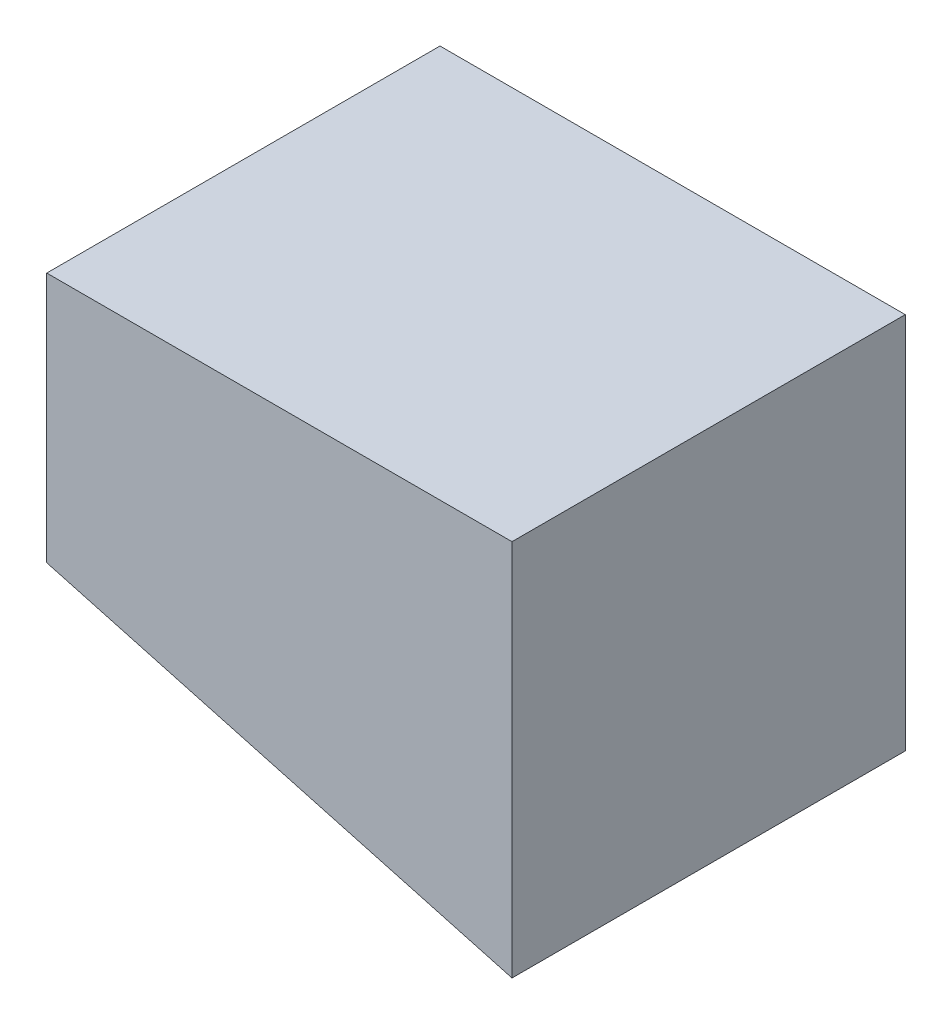
ISO-10303-21;
HEADER;
FILE_DESCRIPTION(('STEP AP214'),'2;1');
FILE_NAME('part.step','',(''),(''),'','','');
FILE_SCHEMA(('AUTOMOTIVE_DESIGN { 1 0 10303 214 1 1 1 1 }'));
ENDSEC;
DATA;
#1=APPLICATION_CONTEXT('core data for automotive mechanical design processes');
#2=APPLICATION_PROTOCOL_DEFINITION('international standard','automotive_design',2000,#1);
#3=PRODUCT_CONTEXT('',#1,'mechanical');
#4=PRODUCT('Part','Part','',(#3));
#5=PRODUCT_RELATED_PRODUCT_CATEGORY('part','',(#4));
#6=PRODUCT_DEFINITION_FORMATION('','',#4);
#7=PRODUCT_DEFINITION_CONTEXT('part definition',#1,'design');
#8=PRODUCT_DEFINITION('design','',#6,#7);
#9=PRODUCT_DEFINITION_SHAPE('','',#8);
#10=(LENGTH_UNIT() NAMED_UNIT(*) SI_UNIT(.MILLI.,.METRE.));
#11=(NAMED_UNIT(*) PLANE_ANGLE_UNIT() SI_UNIT($,.RADIAN.));
#12=(NAMED_UNIT(*) SI_UNIT($,.STERADIAN.) SOLID_ANGLE_UNIT());
#13=UNCERTAINTY_MEASURE_WITH_UNIT(LENGTH_MEASURE(1.E-05),#10,'distance_accuracy_value','');
#14=(GEOMETRIC_REPRESENTATION_CONTEXT(3) GLOBAL_UNCERTAINTY_ASSIGNED_CONTEXT((#13)) GLOBAL_UNIT_ASSIGNED_CONTEXT((#10,
#11,#12)) REPRESENTATION_CONTEXT('',''));
#15=CARTESIAN_POINT('',(0.,0.,0.));
#16=DIRECTION('',(0.,0.,1.));
#17=DIRECTION('',(1.,0.,0.));
#18=AXIS2_PLACEMENT_3D('',#15,#16,#17);
#19=CARTESIAN_POINT('',(246.25,400.,208.135));
#20=DIRECTION('',(-1.,0.,0.));
#21=DIRECTION('',(0.,0.,1.));
#22=AXIS2_PLACEMENT_3D('',#19,#20,#21);
#23=PLANE('',#22);
#24=DIRECTION('',(0.,0.,-1.));
#25=VECTOR('',#24,1.);
#26=CARTESIAN_POINT('',(246.25,0.,208.135));
#27=LINE('',#26,#25);
#28=CARTESIAN_POINT('',(246.25,0.,208.135));
#29=VERTEX_POINT('',#28);
#30=CARTESIAN_POINT('',(246.25,0.,-208.135));
#31=VERTEX_POINT('',#30);
#32=EDGE_CURVE('E74',#29,#31,#27,.T.);
#33=ORIENTED_EDGE('',*,*,#32,.T.);
#34=DIRECTION('',(0.,-1.,0.));
#35=VECTOR('',#34,1.);
#36=CARTESIAN_POINT('',(246.25,400.,-208.135));
#37=LINE('',#36,#35);
#38=CARTESIAN_POINT('',(246.25,400.,-208.135));
#39=VERTEX_POINT('',#38);
#40=EDGE_CURVE('E11',#39,#31,#37,.T.);
#41=ORIENTED_EDGE('',*,*,#40,.F.);
#42=DIRECTION('',(0.,0.,-1.));
#43=VECTOR('',#42,1.);
#44=CARTESIAN_POINT('',(246.25,400.,208.135));
#45=LINE('',#44,#43);
#46=CARTESIAN_POINT('',(246.25,400.,208.135));
#47=VERTEX_POINT('',#46);
#48=EDGE_CURVE('E88',#47,#39,#45,.T.);
#49=ORIENTED_EDGE('',*,*,#48,.F.);
#50=DIRECTION('',(0.,-1.,0.));
#51=VECTOR('',#50,1.);
#52=CARTESIAN_POINT('',(246.25,400.,208.135));
#53=LINE('',#52,#51);
#54=EDGE_CURVE('E87',#47,#29,#53,.T.);
#55=ORIENTED_EDGE('',*,*,#54,.T.);
#56=EDGE_LOOP('',(#33,#41,#49,#55));
#57=FACE_BOUND('',#56,.T.);
#58=ADVANCED_FACE('F33',(#57),#23,.F.);
#59=CARTESIAN_POINT('',(-246.25,400.,-208.135));
#60=DIRECTION('',(0.,0.,1.));
#61=DIRECTION('',(1.,0.,0.));
#62=AXIS2_PLACEMENT_3D('',#59,#60,#61);
#63=PLANE('',#62);
#64=ORIENTED_EDGE('',*,*,#40,.T.);
#65=DIRECTION('',(-0.964703627389877,0.263338017196175,0.));
#66=VECTOR('',#65,1.);
#67=CARTESIAN_POINT('',(246.25,0.,-208.135));
#68=LINE('',#67,#66);
#69=CARTESIAN_POINT('',(-246.25,134.439189183956,-208.135));
#70=VERTEX_POINT('',#69);
#71=EDGE_CURVE('E71',#31,#70,#68,.T.);
#72=ORIENTED_EDGE('',*,*,#71,.T.);
#73=DIRECTION('',(0.,-1.,0.));
#74=VECTOR('',#73,1.);
#75=CARTESIAN_POINT('',(-246.25,400.,-208.135));
#76=LINE('',#75,#74);
#77=CARTESIAN_POINT('',(-246.25,400.,-208.135));
#78=VERTEX_POINT('',#77);
#79=EDGE_CURVE('E41',#78,#70,#76,.T.);
#80=ORIENTED_EDGE('',*,*,#79,.F.);
#81=DIRECTION('',(-1.,0.,0.));
#82=VECTOR('',#81,1.);
#83=CARTESIAN_POINT('',(-246.25,400.,-208.135));
#84=LINE('',#83,#82);
#85=EDGE_CURVE('E83',#39,#78,#84,.T.);
#86=ORIENTED_EDGE('',*,*,#85,.F.);
#87=EDGE_LOOP('',(#64,#72,#80,#86));
#88=FACE_BOUND('',#87,.T.);
#89=ADVANCED_FACE('F82',(#88),#63,.F.);
#90=CARTESIAN_POINT('',(-246.25,400.,208.135));
#91=DIRECTION('',(1.,0.,0.));
#92=DIRECTION('',(0.,0.,-1.));
#93=AXIS2_PLACEMENT_3D('',#90,#91,#92);
#94=PLANE('',#93);
#95=ORIENTED_EDGE('',*,*,#79,.T.);
#96=DIRECTION('',(0.,0.,1.));
#97=VECTOR('',#96,1.);
#98=CARTESIAN_POINT('',(-246.25,134.439189183956,-208.135));
#99=LINE('',#98,#97);
#100=CARTESIAN_POINT('',(-246.25,134.439189183956,208.135));
#101=VERTEX_POINT('',#100);
#102=EDGE_CURVE('E69',#70,#101,#99,.T.);
#103=ORIENTED_EDGE('',*,*,#102,.T.);
#104=DIRECTION('',(0.,-1.,0.));
#105=VECTOR('',#104,1.);
#106=CARTESIAN_POINT('',(-246.25,400.,208.135));
#107=LINE('',#106,#105);
#108=CARTESIAN_POINT('',(-246.25,400.,208.135));
#109=VERTEX_POINT('',#108);
#110=EDGE_CURVE('E96',#109,#101,#107,.T.);
#111=ORIENTED_EDGE('',*,*,#110,.F.);
#112=DIRECTION('',(0.,0.,1.));
#113=VECTOR('',#112,1.);
#114=CARTESIAN_POINT('',(-246.25,400.,208.135));
#115=LINE('',#114,#113);
#116=EDGE_CURVE('E102',#78,#109,#115,.T.);
#117=ORIENTED_EDGE('',*,*,#116,.F.);
#118=EDGE_LOOP('',(#95,#103,#111,#117));
#119=FACE_BOUND('',#118,.T.);
#120=ADVANCED_FACE('F100',(#119),#94,.F.);
#121=CARTESIAN_POINT('',(-246.25,400.,208.135));
#122=DIRECTION('',(0.,0.,-1.));
#123=DIRECTION('',(-1.,0.,0.));
#124=AXIS2_PLACEMENT_3D('',#121,#122,#123);
#125=PLANE('',#124);
#126=ORIENTED_EDGE('',*,*,#110,.T.);
#127=DIRECTION('',(-0.964703627389877,0.263338017196175,0.));
#128=VECTOR('',#127,1.);
#129=CARTESIAN_POINT('',(246.25,0.,208.135));
#130=LINE('',#129,#128);
#131=EDGE_CURVE('E79',#29,#101,#130,.T.);
#132=ORIENTED_EDGE('',*,*,#131,.F.);
#133=ORIENTED_EDGE('',*,*,#54,.F.);
#134=DIRECTION('',(1.,0.,0.));
#135=VECTOR('',#134,1.);
#136=CARTESIAN_POINT('',(-246.25,400.,208.135));
#137=LINE('',#136,#135);
#138=EDGE_CURVE('E48',#109,#47,#137,.T.);
#139=ORIENTED_EDGE('',*,*,#138,.F.);
#140=EDGE_LOOP('',(#126,#132,#133,#139));
#141=FACE_BOUND('',#140,.T.);
#142=ADVANCED_FACE('F106',(#141),#125,.F.);
#143=CARTESIAN_POINT('',(0.,400.,0.));
#144=DIRECTION('',(0.,-1.,0.));
#145=DIRECTION('',(0.,0.,-1.));
#146=AXIS2_PLACEMENT_3D('',#143,#144,#145);
#147=PLANE('',#146);
#148=ORIENTED_EDGE('',*,*,#48,.T.);
#149=ORIENTED_EDGE('',*,*,#85,.T.);
#150=ORIENTED_EDGE('',*,*,#116,.T.);
#151=ORIENTED_EDGE('',*,*,#138,.T.);
#152=EDGE_LOOP('',(#148,#149,#150,#151));
#153=FACE_BOUND('',#152,.T.);
#154=ADVANCED_FACE('F107',(#153),#147,.F.);
#155=CARTESIAN_POINT('',(246.25,0.,-208.135));
#156=DIRECTION('',(0.263338017196175,0.964703627389877,0.));
#157=DIRECTION('',(-0.964703627389877,0.263338017196175,0.));
#158=AXIS2_PLACEMENT_3D('',#155,#156,#157);
#159=PLANE('',#158);
#160=ORIENTED_EDGE('',*,*,#131,.T.);
#161=ORIENTED_EDGE('',*,*,#102,.F.);
#162=ORIENTED_EDGE('',*,*,#71,.F.);
#163=ORIENTED_EDGE('',*,*,#32,.F.);
#164=EDGE_LOOP('',(#160,#161,#162,#163));
#165=FACE_BOUND('',#164,.T.);
#166=ADVANCED_FACE('F72',(#165),#159,.F.);
#167=CLOSED_SHELL('',(#58,#89,#120,#142,#154,#166));
#168=MANIFOLD_SOLID_BREP('B2',#167);
#169=ADVANCED_BREP_SHAPE_REPRESENTATION('',(#18,#168),#14);
#170=SHAPE_DEFINITION_REPRESENTATION(#9,#169);
ENDSEC;
END-ISO-10303-21;
